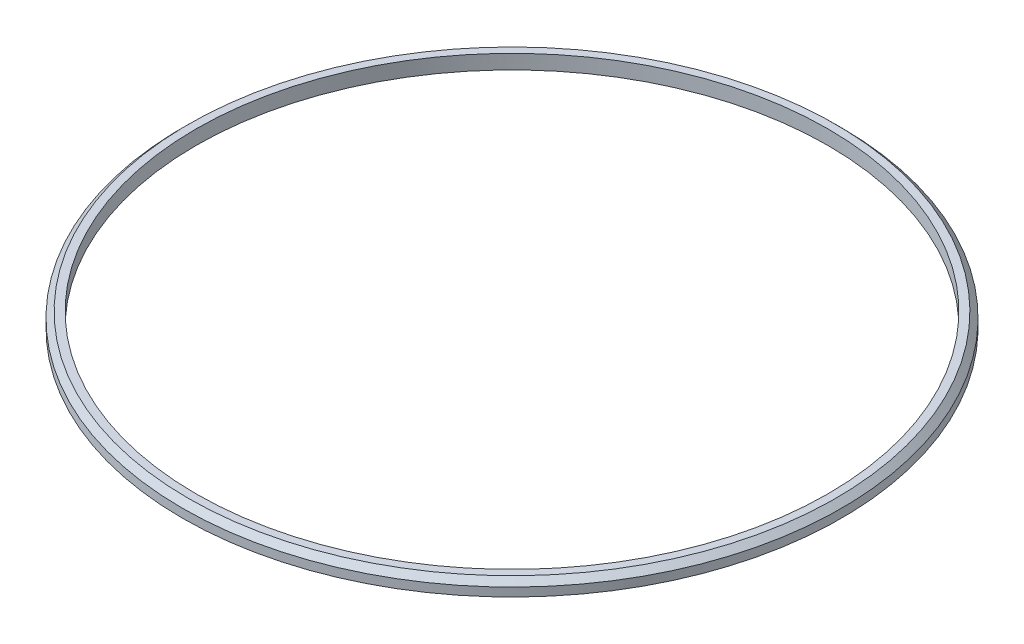
ISO-10303-21;
HEADER;
FILE_DESCRIPTION(('STEP AP214'),'2;1');
FILE_NAME('part.step','',(''),(''),'','','');
FILE_SCHEMA(('AUTOMOTIVE_DESIGN { 1 0 10303 214 1 1 1 1 }'));
ENDSEC;
DATA;
#1=APPLICATION_CONTEXT('core data for automotive mechanical design processes');
#2=APPLICATION_PROTOCOL_DEFINITION('international standard','automotive_design',2000,#1);
#3=PRODUCT_CONTEXT('',#1,'mechanical');
#4=PRODUCT('Part','Part','',(#3));
#5=PRODUCT_RELATED_PRODUCT_CATEGORY('part','',(#4));
#6=PRODUCT_DEFINITION_FORMATION('','',#4);
#7=PRODUCT_DEFINITION_CONTEXT('part definition',#1,'design');
#8=PRODUCT_DEFINITION('design','',#6,#7);
#9=PRODUCT_DEFINITION_SHAPE('','',#8);
#10=(LENGTH_UNIT() NAMED_UNIT(*) SI_UNIT(.MILLI.,.METRE.));
#11=(NAMED_UNIT(*) PLANE_ANGLE_UNIT() SI_UNIT($,.RADIAN.));
#12=(NAMED_UNIT(*) SI_UNIT($,.STERADIAN.) SOLID_ANGLE_UNIT());
#13=UNCERTAINTY_MEASURE_WITH_UNIT(LENGTH_MEASURE(1.E-05),#10,'distance_accuracy_value','');
#14=(GEOMETRIC_REPRESENTATION_CONTEXT(3) GLOBAL_UNCERTAINTY_ASSIGNED_CONTEXT((#13)) GLOBAL_UNIT_ASSIGNED_CONTEXT((#10,
#11,#12)) REPRESENTATION_CONTEXT('',''));
#15=CARTESIAN_POINT('',(0.,0.,0.));
#16=DIRECTION('',(0.,0.,1.));
#17=DIRECTION('',(1.,0.,0.));
#18=AXIS2_PLACEMENT_3D('',#15,#16,#17);
#19=CARTESIAN_POINT('',(0.,2.5,0.));
#20=DIRECTION('',(0.,1.,0.));
#21=DIRECTION('',(0.,0.,1.));
#22=AXIS2_PLACEMENT_3D('',#19,#20,#21);
#23=PLANE('',#22);
#24=CARTESIAN_POINT('',(0.,2.5,0.));
#25=DIRECTION('',(0.,1.,0.));
#26=DIRECTION('',(0.,0.,1.));
#27=AXIS2_PLACEMENT_3D('',#24,#25,#26);
#28=CIRCLE('',#27,56.225);
#29=CARTESIAN_POINT('',(0.,2.5,56.225));
#30=VERTEX_POINT('',#29);
#31=EDGE_CURVE('E41',#30,#30,#28,.T.);
#32=ORIENTED_EDGE('',*,*,#31,.T.);
#33=EDGE_LOOP('',(#32));
#34=FACE_BOUND('',#33,.T.);
#35=CARTESIAN_POINT('',(0.,2.5,0.));
#36=DIRECTION('',(0.,1.,0.));
#37=DIRECTION('',(0.,0.,1.));
#38=AXIS2_PLACEMENT_3D('',#35,#36,#37);
#39=CIRCLE('',#38,54.875);
#40=CARTESIAN_POINT('',(0.,2.5,54.875));
#41=VERTEX_POINT('',#40);
#42=EDGE_CURVE('E49',#41,#41,#39,.T.);
#43=ORIENTED_EDGE('',*,*,#42,.F.);
#44=EDGE_LOOP('',(#43));
#45=FACE_BOUND('',#44,.T.);
#46=ADVANCED_FACE('F33',(#34,#45),#23,.T.);
#47=CARTESIAN_POINT('',(0.,0.,0.));
#48=DIRECTION('',(0.,1.,0.));
#49=DIRECTION('',(0.,0.,1.));
#50=AXIS2_PLACEMENT_3D('',#47,#48,#49);
#51=PLANE('',#50);
#52=CARTESIAN_POINT('',(0.,0.,0.));
#53=DIRECTION('',(0.,1.,0.));
#54=DIRECTION('',(0.,0.,1.));
#55=AXIS2_PLACEMENT_3D('',#52,#53,#54);
#56=CIRCLE('',#55,57.225);
#57=CARTESIAN_POINT('',(0.,0.,57.225));
#58=VERTEX_POINT('',#57);
#59=EDGE_CURVE('E45',#58,#58,#56,.T.);
#60=ORIENTED_EDGE('',*,*,#59,.F.);
#61=EDGE_LOOP('',(#60));
#62=FACE_BOUND('',#61,.T.);
#63=CARTESIAN_POINT('',(0.,0.,0.));
#64=DIRECTION('',(0.,1.,0.));
#65=DIRECTION('',(0.,0.,1.));
#66=AXIS2_PLACEMENT_3D('',#63,#64,#65);
#67=CIRCLE('',#66,54.875);
#68=CARTESIAN_POINT('',(0.,0.,54.875));
#69=VERTEX_POINT('',#68);
#70=EDGE_CURVE('E52',#69,#69,#67,.T.);
#71=ORIENTED_EDGE('',*,*,#70,.T.);
#72=EDGE_LOOP('',(#71));
#73=FACE_BOUND('',#72,.T.);
#74=ADVANCED_FACE('F62',(#62,#73),#51,.F.);
#75=CARTESIAN_POINT('',(0.,2.5,0.));
#76=DIRECTION('',(0.,-1.,0.));
#77=DIRECTION('',(0.,0.,-1.));
#78=AXIS2_PLACEMENT_3D('',#75,#76,#77);
#79=CYLINDRICAL_SURFACE('',#78,57.225);
#80=CARTESIAN_POINT('',(0.,1.49999999999999,0.));
#81=DIRECTION('',(0.,1.,0.));
#82=DIRECTION('',(0.,0.,1.));
#83=AXIS2_PLACEMENT_3D('',#80,#81,#82);
#84=CIRCLE('',#83,57.225);
#85=CARTESIAN_POINT('',(0.,1.49999999999999,57.225));
#86=VERTEX_POINT('',#85);
#87=EDGE_CURVE('E10',#86,#86,#84,.F.);
#88=ORIENTED_EDGE('',*,*,#87,.T.);
#89=EDGE_LOOP('',(#88));
#90=FACE_BOUND('',#89,.T.);
#91=ORIENTED_EDGE('',*,*,#59,.T.);
#92=EDGE_LOOP('',(#91));
#93=FACE_BOUND('',#92,.T.);
#94=ADVANCED_FACE('F67',(#90,#93),#79,.T.);
#95=CARTESIAN_POINT('',(0.,2.5,0.));
#96=DIRECTION('',(0.,-1.,0.));
#97=DIRECTION('',(0.,0.,-1.));
#98=AXIS2_PLACEMENT_3D('',#95,#96,#97);
#99=CYLINDRICAL_SURFACE('',#98,54.875);
#100=ORIENTED_EDGE('',*,*,#42,.T.);
#101=EDGE_LOOP('',(#100));
#102=FACE_BOUND('',#101,.T.);
#103=ORIENTED_EDGE('',*,*,#70,.F.);
#104=EDGE_LOOP('',(#103));
#105=FACE_BOUND('',#104,.T.);
#106=ADVANCED_FACE('F58',(#102,#105),#99,.F.);
#107=CARTESIAN_POINT('',(0.,2.5,0.));
#108=DIRECTION('',(0.,-1.,0.));
#109=DIRECTION('',(0.,0.,-1.));
#110=AXIS2_PLACEMENT_3D('',#107,#108,#109);
#111=CONICAL_SURFACE('',#110,56.225,0.785398163397445);
#112=ORIENTED_EDGE('',*,*,#87,.F.);
#113=EDGE_LOOP('',(#112));
#114=FACE_BOUND('',#113,.T.);
#115=ORIENTED_EDGE('',*,*,#31,.F.);
#116=EDGE_LOOP('',(#115));
#117=FACE_BOUND('',#116,.T.);
#118=ADVANCED_FACE('F36',(#114,#117),#111,.T.);
#119=CLOSED_SHELL('',(#46,#74,#94,#106,#118));
#120=MANIFOLD_SOLID_BREP('B2',#119);
#121=ADVANCED_BREP_SHAPE_REPRESENTATION('',(#18,#120),#14);
#122=SHAPE_DEFINITION_REPRESENTATION(#9,#121);
ENDSEC;
END-ISO-10303-21;
